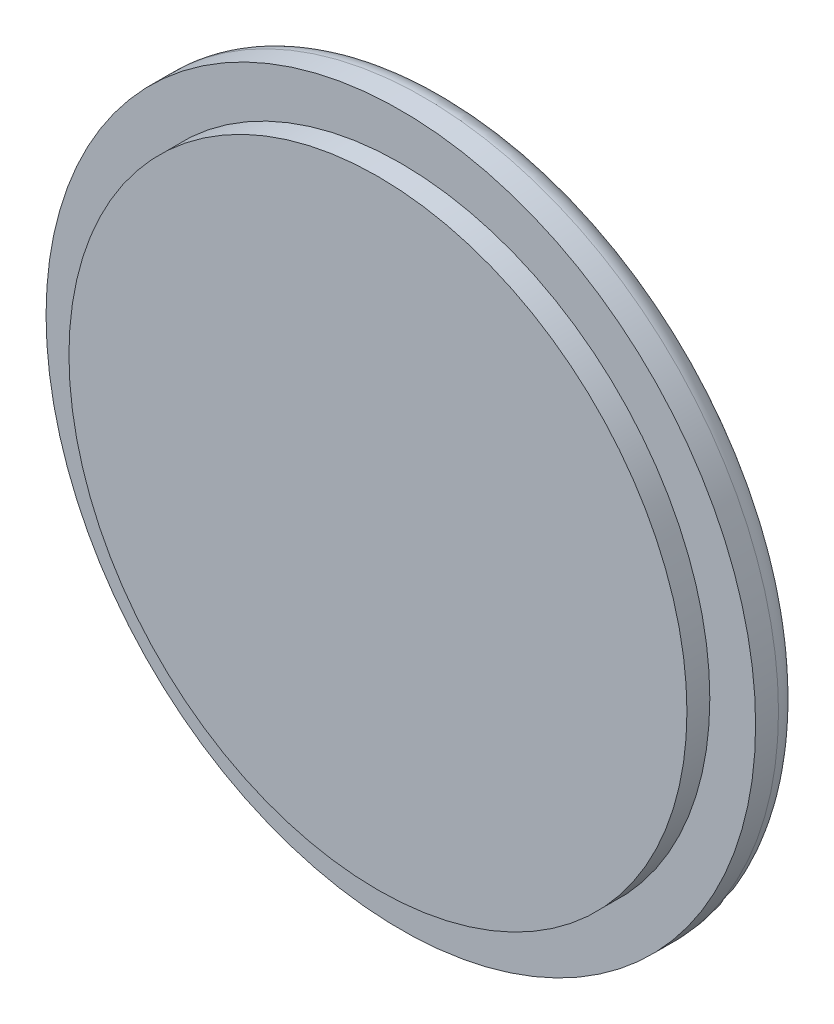
ISO-10303-21;
HEADER;
FILE_DESCRIPTION(('STEP AP214'),'2;1');
FILE_NAME('part.step','',(''),(''),'','','');
FILE_SCHEMA(('AUTOMOTIVE_DESIGN { 1 0 10303 214 1 1 1 1 }'));
ENDSEC;
DATA;
#1=APPLICATION_CONTEXT('core data for automotive mechanical design processes');
#2=APPLICATION_PROTOCOL_DEFINITION('international standard','automotive_design',2000,#1);
#3=PRODUCT_CONTEXT('',#1,'mechanical');
#4=PRODUCT('Part','Part','',(#3));
#5=PRODUCT_RELATED_PRODUCT_CATEGORY('part','',(#4));
#6=PRODUCT_DEFINITION_FORMATION('','',#4);
#7=PRODUCT_DEFINITION_CONTEXT('part definition',#1,'design');
#8=PRODUCT_DEFINITION('design','',#6,#7);
#9=PRODUCT_DEFINITION_SHAPE('','',#8);
#10=(LENGTH_UNIT() NAMED_UNIT(*) SI_UNIT(.MILLI.,.METRE.));
#11=(NAMED_UNIT(*) PLANE_ANGLE_UNIT() SI_UNIT($,.RADIAN.));
#12=(NAMED_UNIT(*) SI_UNIT($,.STERADIAN.) SOLID_ANGLE_UNIT());
#13=UNCERTAINTY_MEASURE_WITH_UNIT(LENGTH_MEASURE(1.E-05),#10,'distance_accuracy_value','');
#14=(GEOMETRIC_REPRESENTATION_CONTEXT(3) GLOBAL_UNCERTAINTY_ASSIGNED_CONTEXT((#13)) GLOBAL_UNIT_ASSIGNED_CONTEXT((#10,
#11,#12)) REPRESENTATION_CONTEXT('',''));
#15=CARTESIAN_POINT('',(0.,0.,0.));
#16=DIRECTION('',(0.,0.,1.));
#17=DIRECTION('',(1.,0.,0.));
#18=AXIS2_PLACEMENT_3D('',#15,#16,#17);
#19=CARTESIAN_POINT('',(0.,145.,-30.));
#20=DIRECTION('',(0.,0.,-1.));
#21=DIRECTION('',(-1.,0.,0.));
#22=AXIS2_PLACEMENT_3D('',#19,#20,#21);
#23=PLANE('',#22);
#24=CARTESIAN_POINT('',(0.,0.,-30.));
#25=DIRECTION('',(0.,0.,-1.));
#26=DIRECTION('',(-1.,0.,0.));
#27=AXIS2_PLACEMENT_3D('',#24,#25,#26);
#28=CIRCLE('',#27,145.);
#29=CARTESIAN_POINT('',(-145.,0.,-30.));
#30=VERTEX_POINT('',#29);
#31=EDGE_CURVE('E10',#30,#30,#28,.T.);
#32=ORIENTED_EDGE('',*,*,#31,.T.);
#33=EDGE_LOOP('',(#32));
#34=FACE_BOUND('',#33,.T.);
#35=ADVANCED_FACE('F39',(#34),#23,.T.);
#36=CARTESIAN_POINT('',(0.,0.,-20.));
#37=DIRECTION('',(0.,0.,-1.));
#38=DIRECTION('',(-1.,0.,0.));
#39=AXIS2_PLACEMENT_3D('',#36,#37,#38);
#40=TOROIDAL_SURFACE('',#39,145.,10.);
#41=CARTESIAN_POINT('',(0.,0.,-20.));
#42=DIRECTION('',(0.,0.,-1.));
#43=DIRECTION('',(-1.,0.,0.));
#44=AXIS2_PLACEMENT_3D('',#41,#42,#43);
#45=CIRCLE('',#44,155.);
#46=CARTESIAN_POINT('',(-155.,0.,-20.));
#47=VERTEX_POINT('',#46);
#48=EDGE_CURVE('E46',#47,#47,#45,.T.);
#49=ORIENTED_EDGE('',*,*,#48,.T.);
#50=EDGE_LOOP('',(#49));
#51=FACE_BOUND('',#50,.T.);
#52=ORIENTED_EDGE('',*,*,#31,.F.);
#53=EDGE_LOOP('',(#52));
#54=FACE_BOUND('',#53,.T.);
#55=ADVANCED_FACE('F79',(#51,#54),#40,.T.);
#56=CARTESIAN_POINT('',(0.,0.,-30.));
#57=DIRECTION('',(0.,0.,-1.));
#58=DIRECTION('',(-1.,0.,0.));
#59=AXIS2_PLACEMENT_3D('',#56,#57,#58);
#60=CYLINDRICAL_SURFACE('',#59,155.);
#61=CARTESIAN_POINT('',(0.,0.,-10.));
#62=DIRECTION('',(0.,0.,-1.));
#63=DIRECTION('',(-1.,0.,0.));
#64=AXIS2_PLACEMENT_3D('',#61,#62,#63);
#65=CIRCLE('',#64,155.);
#66=CARTESIAN_POINT('',(-155.,0.,-10.));
#67=VERTEX_POINT('',#66);
#68=EDGE_CURVE('E51',#67,#67,#65,.T.);
#69=ORIENTED_EDGE('',*,*,#68,.T.);
#70=EDGE_LOOP('',(#69));
#71=FACE_BOUND('',#70,.T.);
#72=ORIENTED_EDGE('',*,*,#48,.F.);
#73=EDGE_LOOP('',(#72));
#74=FACE_BOUND('',#73,.T.);
#75=ADVANCED_FACE('F83',(#71,#74),#60,.T.);
#76=CARTESIAN_POINT('',(0.,135.,-10.));
#77=DIRECTION('',(0.,0.,1.));
#78=DIRECTION('',(1.,0.,0.));
#79=AXIS2_PLACEMENT_3D('',#76,#77,#78);
#80=PLANE('',#79);
#81=CARTESIAN_POINT('',(0.,0.,-10.));
#82=DIRECTION('',(0.,0.,-1.));
#83=DIRECTION('',(-1.,0.,0.));
#84=AXIS2_PLACEMENT_3D('',#81,#82,#83);
#85=CIRCLE('',#84,135.);
#86=CARTESIAN_POINT('',(-135.,0.,-10.));
#87=VERTEX_POINT('',#86);
#88=EDGE_CURVE('E56',#87,#87,#85,.T.);
#89=ORIENTED_EDGE('',*,*,#88,.T.);
#90=EDGE_LOOP('',(#89));
#91=FACE_BOUND('',#90,.T.);
#92=ORIENTED_EDGE('',*,*,#68,.F.);
#93=EDGE_LOOP('',(#92));
#94=FACE_BOUND('',#93,.T.);
#95=ADVANCED_FACE('F76',(#91,#94),#80,.T.);
#96=CARTESIAN_POINT('',(0.,0.,-30.));
#97=DIRECTION('',(0.,0.,-1.));
#98=DIRECTION('',(-1.,0.,0.));
#99=AXIS2_PLACEMENT_3D('',#96,#97,#98);
#100=CYLINDRICAL_SURFACE('',#99,135.);
#101=CARTESIAN_POINT('',(0.,0.,0.));
#102=DIRECTION('',(0.,0.,-1.));
#103=DIRECTION('',(-1.,0.,0.));
#104=AXIS2_PLACEMENT_3D('',#101,#102,#103);
#105=CIRCLE('',#104,135.);
#106=CARTESIAN_POINT('',(-135.,0.,0.));
#107=VERTEX_POINT('',#106);
#108=EDGE_CURVE('E62',#107,#107,#105,.T.);
#109=ORIENTED_EDGE('',*,*,#108,.T.);
#110=EDGE_LOOP('',(#109));
#111=FACE_BOUND('',#110,.T.);
#112=ORIENTED_EDGE('',*,*,#88,.F.);
#113=EDGE_LOOP('',(#112));
#114=FACE_BOUND('',#113,.T.);
#115=ADVANCED_FACE('F67',(#111,#114),#100,.T.);
#116=CARTESIAN_POINT('',(0.,0.,0.));
#117=DIRECTION('',(0.,0.,1.));
#118=DIRECTION('',(1.,0.,0.));
#119=AXIS2_PLACEMENT_3D('',#116,#117,#118);
#120=PLANE('',#119);
#121=ORIENTED_EDGE('',*,*,#108,.F.);
#122=EDGE_LOOP('',(#121));
#123=FACE_BOUND('',#122,.T.);
#124=ADVANCED_FACE('F70',(#123),#120,.T.);
#125=CLOSED_SHELL('',(#35,#55,#75,#95,#115,#124));
#126=MANIFOLD_SOLID_BREP('B2',#125);
#127=ADVANCED_BREP_SHAPE_REPRESENTATION('',(#18,#126),#14);
#128=SHAPE_DEFINITION_REPRESENTATION(#9,#127);
ENDSEC;
END-ISO-10303-21;
